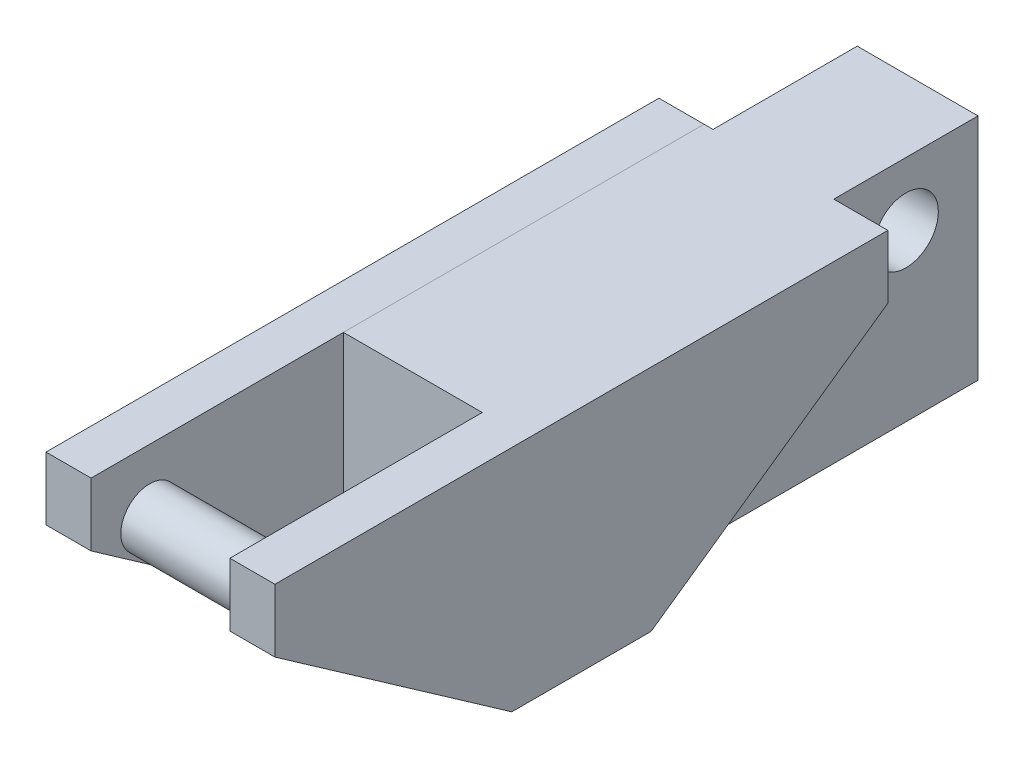
ISO-10303-21;
HEADER;
FILE_DESCRIPTION(('STEP AP214'),'2;1');
FILE_NAME('part.step','',(''),(''),'','','');
FILE_SCHEMA(('AUTOMOTIVE_DESIGN { 1 0 10303 214 1 1 1 1 }'));
ENDSEC;
DATA;
#1=APPLICATION_CONTEXT('core data for automotive mechanical design processes');
#2=APPLICATION_PROTOCOL_DEFINITION('international standard','automotive_design',2000,#1);
#3=PRODUCT_CONTEXT('',#1,'mechanical');
#4=PRODUCT('Part','Part','',(#3));
#5=PRODUCT_RELATED_PRODUCT_CATEGORY('part','',(#4));
#6=PRODUCT_DEFINITION_FORMATION('','',#4);
#7=PRODUCT_DEFINITION_CONTEXT('part definition',#1,'design');
#8=PRODUCT_DEFINITION('design','',#6,#7);
#9=PRODUCT_DEFINITION_SHAPE('','',#8);
#10=(LENGTH_UNIT() NAMED_UNIT(*) SI_UNIT(.MILLI.,.METRE.));
#11=(NAMED_UNIT(*) PLANE_ANGLE_UNIT() SI_UNIT($,.RADIAN.));
#12=(NAMED_UNIT(*) SI_UNIT($,.STERADIAN.) SOLID_ANGLE_UNIT());
#13=UNCERTAINTY_MEASURE_WITH_UNIT(LENGTH_MEASURE(1.E-05),#10,'distance_accuracy_value','');
#14=(GEOMETRIC_REPRESENTATION_CONTEXT(3) GLOBAL_UNCERTAINTY_ASSIGNED_CONTEXT((#13)) GLOBAL_UNIT_ASSIGNED_CONTEXT((#10,
#11,#12)) REPRESENTATION_CONTEXT('',''));
#15=CARTESIAN_POINT('',(0.,0.,0.));
#16=DIRECTION('',(0.,0.,1.));
#17=DIRECTION('',(1.,0.,0.));
#18=AXIS2_PLACEMENT_3D('',#15,#16,#17);
#19=CARTESIAN_POINT('',(-28.7781796503859,-0.00999999999999959,18.4558038197349));
#20=DIRECTION('',(1.,0.,0.));
#21=DIRECTION('',(0.,0.,-1.));
#22=AXIS2_PLACEMENT_3D('',#19,#20,#21);
#23=PLANE('',#22);
#24=DIRECTION('',(0.,-1.,0.));
#25=VECTOR('',#24,1.);
#26=CARTESIAN_POINT('',(-28.7781796503859,12.7,18.4558038197349));
#27=LINE('',#26,#25);
#28=CARTESIAN_POINT('',(-28.7781796503859,12.7,18.4558038197349));
#29=VERTEX_POINT('',#28);
#30=CARTESIAN_POINT('',(-28.7781796503859,9.2,18.4558038197349));
#31=VERTEX_POINT('',#30);
#32=EDGE_CURVE('E136',#29,#31,#27,.T.);
#33=ORIENTED_EDGE('',*,*,#32,.T.);
#34=DIRECTION('',(0.,-0.57357643635105,-0.819152044288989));
#35=VECTOR('',#34,1.);
#36=CARTESIAN_POINT('',(-28.7781796503859,1.68007341914141,7.71623566243481));
#37=LINE('',#36,#35);
#38=CARTESIAN_POINT('',(-28.7781796503859,0.,5.31684215770763));
#39=VERTEX_POINT('',#38);
#40=EDGE_CURVE('E90',#31,#39,#37,.T.);
#41=ORIENTED_EDGE('',*,*,#40,.T.);
#42=DIRECTION('',(0.,0.,-1.));
#43=VECTOR('',#42,1.);
#44=CARTESIAN_POINT('',(-28.7781796503859,0.,0.));
#45=LINE('',#44,#43);
#46=CARTESIAN_POINT('',(-28.7781796503859,0.,-2.40523451823775));
#47=VERTEX_POINT('',#46);
#48=EDGE_CURVE('E152',#39,#47,#45,.T.);
#49=ORIENTED_EDGE('',*,*,#48,.T.);
#50=DIRECTION('',(0.,-0.57357643635105,0.819152044288989));
#51=VECTOR('',#50,1.);
#52=CARTESIAN_POINT('',(-28.7781796503859,9.2,-15.5441961802651));
#53=LINE('',#52,#51);
#54=CARTESIAN_POINT('',(-28.7781796503859,9.2,-15.5441961802651));
#55=VERTEX_POINT('',#54);
#56=EDGE_CURVE('E127',#55,#47,#53,.T.);
#57=ORIENTED_EDGE('',*,*,#56,.F.);
#58=DIRECTION('',(0.,-1.,0.));
#59=VECTOR('',#58,1.);
#60=CARTESIAN_POINT('',(-28.7781796503859,12.7,-15.5441961802651));
#61=LINE('',#60,#59);
#62=CARTESIAN_POINT('',(-28.7781796503859,12.7,-15.5441961802651));
#63=VERTEX_POINT('',#62);
#64=EDGE_CURVE('E126',#63,#55,#61,.T.);
#65=ORIENTED_EDGE('',*,*,#64,.F.);
#66=DIRECTION('',(0.,0.,-1.));
#67=VECTOR('',#66,1.);
#68=CARTESIAN_POINT('',(-28.7781796503859,12.7,0.));
#69=LINE('',#68,#67);
#70=EDGE_CURVE('E114',#29,#63,#69,.T.);
#71=ORIENTED_EDGE('',*,*,#70,.F.);
#72=EDGE_LOOP('',(#33,#41,#49,#57,#65,#71));
#73=FACE_BOUND('',#72,.T.);
#74=ADVANCED_FACE('F57',(#73),#23,.T.);
#75=CARTESIAN_POINT('',(0.,0.,0.));
#76=DIRECTION('',(0.,1.,0.));
#77=DIRECTION('',(0.,0.,1.));
#78=AXIS2_PLACEMENT_3D('',#75,#76,#77);
#79=PLANE('',#78);
#80=DIRECTION('',(-1.,0.,0.));
#81=VECTOR('',#80,1.);
#82=CARTESIAN_POINT('',(-28.2781796503859,0.,-2.40523451823775));
#83=LINE('',#82,#81);
#84=CARTESIAN_POINT('',(-31.2781796503859,0.,-2.40523451823775));
#85=VERTEX_POINT('',#84);
#86=EDGE_CURVE('E61',#47,#85,#83,.T.);
#87=ORIENTED_EDGE('',*,*,#86,.F.);
#88=ORIENTED_EDGE('',*,*,#48,.F.);
#89=DIRECTION('',(-1.,0.,0.));
#90=VECTOR('',#89,1.);
#91=CARTESIAN_POINT('',(-28.2781796503859,0.,5.31684215770763));
#92=LINE('',#91,#90);
#93=CARTESIAN_POINT('',(-31.2781796503859,0.,5.31684215770763));
#94=VERTEX_POINT('',#93);
#95=EDGE_CURVE('E140',#39,#94,#92,.T.);
#96=ORIENTED_EDGE('',*,*,#95,.T.);
#97=DIRECTION('',(0.,0.,1.));
#98=VECTOR('',#97,1.);
#99=CARTESIAN_POINT('',(-31.2781796503859,0.,0.));
#100=LINE('',#99,#98);
#101=EDGE_CURVE('E154',#85,#94,#100,.T.);
#102=ORIENTED_EDGE('',*,*,#101,.F.);
#103=EDGE_LOOP('',(#87,#88,#96,#102));
#104=FACE_BOUND('',#103,.T.);
#105=ADVANCED_FACE('F167',(#104),#79,.F.);
#106=CARTESIAN_POINT('',(-31.2781796503859,12.7,0.));
#107=DIRECTION('',(1.,0.,0.));
#108=DIRECTION('',(0.,0.,-1.));
#109=AXIS2_PLACEMENT_3D('',#106,#107,#108);
#110=PLANE('',#109);
#111=ORIENTED_EDGE('',*,*,#101,.T.);
#112=DIRECTION('',(0.,-0.57357643635105,-0.819152044288989));
#113=VECTOR('',#112,1.);
#114=CARTESIAN_POINT('',(-31.2781796503859,9.2,18.4558038197349));
#115=LINE('',#114,#113);
#116=CARTESIAN_POINT('',(-31.2781796503859,9.2,18.4558038197349));
#117=VERTEX_POINT('',#116);
#118=EDGE_CURVE('E85',#117,#94,#115,.T.);
#119=ORIENTED_EDGE('',*,*,#118,.F.);
#120=DIRECTION('',(0.,-1.,0.));
#121=VECTOR('',#120,1.);
#122=CARTESIAN_POINT('',(-31.2781796503859,12.7,18.4558038197349));
#123=LINE('',#122,#121);
#124=CARTESIAN_POINT('',(-31.2781796503859,12.7,18.4558038197349));
#125=VERTEX_POINT('',#124);
#126=EDGE_CURVE('E145',#125,#117,#123,.T.);
#127=ORIENTED_EDGE('',*,*,#126,.F.);
#128=DIRECTION('',(0.,0.,1.));
#129=VECTOR('',#128,1.);
#130=CARTESIAN_POINT('',(-31.2781796503859,12.7,0.));
#131=LINE('',#130,#129);
#132=CARTESIAN_POINT('',(-31.2781796503859,12.7,-15.5441961802651));
#133=VERTEX_POINT('',#132);
#134=EDGE_CURVE('E155',#133,#125,#131,.T.);
#135=ORIENTED_EDGE('',*,*,#134,.F.);
#136=DIRECTION('',(0.,-1.,0.));
#137=VECTOR('',#136,1.);
#138=CARTESIAN_POINT('',(-31.2781796503859,12.7,-15.5441961802651));
#139=LINE('',#138,#137);
#140=CARTESIAN_POINT('',(-31.2781796503859,9.2,-15.5441961802651));
#141=VERTEX_POINT('',#140);
#142=EDGE_CURVE('E133',#133,#141,#139,.T.);
#143=ORIENTED_EDGE('',*,*,#142,.T.);
#144=DIRECTION('',(0.,-0.57357643635105,0.819152044288989));
#145=VECTOR('',#144,1.);
#146=CARTESIAN_POINT('',(-31.2781796503859,9.2,-15.5441961802651));
#147=LINE('',#146,#145);
#148=EDGE_CURVE('E12',#141,#85,#147,.T.);
#149=ORIENTED_EDGE('',*,*,#148,.T.);
#150=EDGE_LOOP('',(#111,#119,#127,#135,#143,#149));
#151=FACE_BOUND('',#150,.T.);
#152=ADVANCED_FACE('F163',(#151),#110,.F.);
#153=CARTESIAN_POINT('',(0.,12.7,18.4558038197349));
#154=DIRECTION('',(0.,0.,-1.));
#155=DIRECTION('',(-1.,0.,0.));
#156=AXIS2_PLACEMENT_3D('',#153,#154,#155);
#157=PLANE('',#156);
#158=ORIENTED_EDGE('',*,*,#126,.T.);
#159=DIRECTION('',(-1.,0.,0.));
#160=VECTOR('',#159,1.);
#161=CARTESIAN_POINT('',(-28.2781796503859,9.2,18.4558038197349));
#162=LINE('',#161,#160);
#163=EDGE_CURVE('E142',#31,#117,#162,.T.);
#164=ORIENTED_EDGE('',*,*,#163,.F.);
#165=ORIENTED_EDGE('',*,*,#32,.F.);
#166=DIRECTION('',(1.,0.,0.));
#167=VECTOR('',#166,1.);
#168=CARTESIAN_POINT('',(0.,12.7,18.4558038197349));
#169=LINE('',#168,#167);
#170=EDGE_CURVE('E120',#125,#29,#169,.T.);
#171=ORIENTED_EDGE('',*,*,#170,.F.);
#172=EDGE_LOOP('',(#158,#164,#165,#171));
#173=FACE_BOUND('',#172,.T.);
#174=ADVANCED_FACE('F165',(#173),#157,.F.);
#175=CARTESIAN_POINT('',(-28.2781796503859,9.2,18.4558038197349));
#176=DIRECTION('',(0.,0.819152044288989,-0.57357643635105));
#177=DIRECTION('',(0.,0.57357643635105,0.819152044288989));
#178=AXIS2_PLACEMENT_3D('',#175,#176,#177);
#179=PLANE('',#178);
#180=ORIENTED_EDGE('',*,*,#163,.T.);
#181=ORIENTED_EDGE('',*,*,#118,.T.);
#182=ORIENTED_EDGE('',*,*,#95,.F.);
#183=ORIENTED_EDGE('',*,*,#40,.F.);
#184=EDGE_LOOP('',(#180,#181,#182,#183));
#185=FACE_BOUND('',#184,.T.);
#186=ADVANCED_FACE('F159',(#185),#179,.F.);
#187=CARTESIAN_POINT('',(0.,12.7,-15.5441961802651));
#188=DIRECTION('',(0.,0.,-1.));
#189=DIRECTION('',(-1.,0.,0.));
#190=AXIS2_PLACEMENT_3D('',#187,#188,#189);
#191=PLANE('',#190);
#192=DIRECTION('',(1.,0.,0.));
#193=VECTOR('',#192,1.);
#194=CARTESIAN_POINT('',(0.,12.7,-15.5441961802651));
#195=LINE('',#194,#193);
#196=EDGE_CURVE('E119',#133,#63,#195,.T.);
#197=ORIENTED_EDGE('',*,*,#196,.T.);
#198=ORIENTED_EDGE('',*,*,#64,.T.);
#199=DIRECTION('',(-1.,0.,0.));
#200=VECTOR('',#199,1.);
#201=CARTESIAN_POINT('',(-28.2781796503859,9.2,-15.5441961802651));
#202=LINE('',#201,#200);
#203=EDGE_CURVE('E139',#55,#141,#202,.T.);
#204=ORIENTED_EDGE('',*,*,#203,.T.);
#205=ORIENTED_EDGE('',*,*,#142,.F.);
#206=EDGE_LOOP('',(#197,#198,#204,#205));
#207=FACE_BOUND('',#206,.T.);
#208=ADVANCED_FACE('F131',(#207),#191,.T.);
#209=CARTESIAN_POINT('',(-28.2781796503859,9.2,-15.5441961802651));
#210=DIRECTION('',(0.,-0.819152044288989,-0.57357643635105));
#211=DIRECTION('',(0.,0.57357643635105,-0.819152044288989));
#212=AXIS2_PLACEMENT_3D('',#209,#210,#211);
#213=PLANE('',#212);
#214=ORIENTED_EDGE('',*,*,#203,.F.);
#215=ORIENTED_EDGE('',*,*,#56,.T.);
#216=ORIENTED_EDGE('',*,*,#86,.T.);
#217=ORIENTED_EDGE('',*,*,#148,.F.);
#218=EDGE_LOOP('',(#214,#215,#216,#217));
#219=FACE_BOUND('',#218,.T.);
#220=ADVANCED_FACE('F59',(#219),#213,.T.);
#221=CARTESIAN_POINT('',(0.,12.7,0.));
#222=DIRECTION('',(0.,1.,0.));
#223=DIRECTION('',(0.,0.,1.));
#224=AXIS2_PLACEMENT_3D('',#221,#222,#223);
#225=PLANE('',#224);
#226=ORIENTED_EDGE('',*,*,#70,.T.);
#227=ORIENTED_EDGE('',*,*,#196,.F.);
#228=ORIENTED_EDGE('',*,*,#134,.T.);
#229=ORIENTED_EDGE('',*,*,#170,.T.);
#230=EDGE_LOOP('',(#226,#227,#228,#229));
#231=FACE_BOUND('',#230,.T.);
#232=ADVANCED_FACE('F116',(#231),#225,.T.);
#233=CLOSED_SHELL('',(#74,#105,#152,#174,#186,#208,#220,#232));
#234=MANIFOLD_SOLID_BREP('B2',#233);
#235=CARTESIAN_POINT('',(-28.7781796503859,-0.00999999999999959,18.4558038197349));
#236=DIRECTION('',(1.,0.,0.));
#237=DIRECTION('',(0.,0.,-1.));
#238=AXIS2_PLACEMENT_3D('',#235,#236,#237);
#239=PLANE('',#238);
#240=CARTESIAN_POINT('',(-28.7781796503859,9.2,15.2058038197349));
#241=DIRECTION('',(-1.,0.,0.));
#242=DIRECTION('',(0.,0.,1.));
#243=AXIS2_PLACEMENT_3D('',#240,#241,#242);
#244=CIRCLE('',#243,1.6);
#245=CARTESIAN_POINT('',(-28.7781796503859,9.2,13.6058038197349));
#246=VERTEX_POINT('',#245);
#247=EDGE_CURVE('E429',#246,#246,#244,.F.);
#248=ORIENTED_EDGE('',*,*,#247,.F.);
#249=EDGE_LOOP('',(#248));
#250=FACE_BOUND('',#249,.T.);
#251=ADVANCED_FACE('F292',(#250),#239,.F.);
#252=DIRECTION('',(0.,0.,-1.));
#253=VECTOR('',#252,1.);
#254=CARTESIAN_POINT('',(-28.7781796503859,12.7,0.));
#255=LINE('',#254,#253);
#256=CARTESIAN_POINT('',(-28.7781796503859,12.7,4.45580381973494));
#257=VERTEX_POINT('',#256);
#258=CARTESIAN_POINT('',(-28.7781796503859,12.7,-15.5441961802651));
#259=VERTEX_POINT('',#258);
#260=EDGE_CURVE('E299',#257,#259,#255,.T.);
#261=ORIENTED_EDGE('',*,*,#260,.T.);
#262=DIRECTION('',(0.,-1.,0.));
#263=VECTOR('',#262,1.);
#264=CARTESIAN_POINT('',(-28.7781796503859,12.7,-15.5441961802651));
#265=LINE('',#264,#263);
#266=CARTESIAN_POINT('',(-28.7781796503859,9.2,-15.5441961802651));
#267=VERTEX_POINT('',#266);
#268=EDGE_CURVE('E496',#259,#267,#265,.T.);
#269=ORIENTED_EDGE('',*,*,#268,.T.);
#270=DIRECTION('',(0.,-0.57357643635105,0.819152044288989));
#271=VECTOR('',#270,1.);
#272=CARTESIAN_POINT('',(-28.7781796503859,9.2,-15.5441961802651));
#273=LINE('',#272,#271);
#274=CARTESIAN_POINT('',(-28.7781796503859,0.,-2.40523451823775));
#275=VERTEX_POINT('',#274);
#276=EDGE_CURVE('E55',#267,#275,#273,.T.);
#277=ORIENTED_EDGE('',*,*,#276,.T.);
#278=DIRECTION('',(0.,0.,-1.));
#279=VECTOR('',#278,1.);
#280=CARTESIAN_POINT('',(-28.7781796503859,0.,0.));
#281=LINE('',#280,#279);
#282=CARTESIAN_POINT('',(-28.7781796503859,0.,4.45580381973494));
#283=VERTEX_POINT('',#282);
#284=EDGE_CURVE('E312',#283,#275,#281,.T.);
#285=ORIENTED_EDGE('',*,*,#284,.F.);
#286=DIRECTION('',(0.,-1.,0.));
#287=VECTOR('',#286,1.);
#288=CARTESIAN_POINT('',(-28.7781796503859,12.7,4.45580381973494));
#289=LINE('',#288,#287);
#290=EDGE_CURVE('E488',#257,#283,#289,.T.);
#291=ORIENTED_EDGE('',*,*,#290,.F.);
#292=EDGE_LOOP('',(#261,#269,#277,#285,#291));
#293=FACE_BOUND('',#292,.T.);
#294=ADVANCED_FACE('F498',(#293),#239,.F.);
#295=CARTESIAN_POINT('',(0.,0.,0.));
#296=DIRECTION('',(0.,1.,0.));
#297=DIRECTION('',(0.,0.,1.));
#298=AXIS2_PLACEMENT_3D('',#295,#296,#297);
#299=PLANE('',#298);
#300=DIRECTION('',(1.,0.,0.));
#301=VECTOR('',#300,1.);
#302=CARTESIAN_POINT('',(0.,0.,4.45580381973494));
#303=LINE('',#302,#301);
#304=CARTESIAN_POINT('',(-21.0781796503859,0.,4.45580381973494));
#305=VERTEX_POINT('',#304);
#306=EDGE_CURVE('E436',#283,#305,#303,.T.);
#307=ORIENTED_EDGE('',*,*,#306,.F.);
#308=ORIENTED_EDGE('',*,*,#284,.T.);
#309=DIRECTION('',(-1.,0.,0.));
#310=VECTOR('',#309,1.);
#311=CARTESIAN_POINT('',(-28.2781796503859,0.,-2.40523451823775));
#312=LINE('',#311,#310);
#313=CARTESIAN_POINT('',(-28.2781796503859,0.,-2.40523451823775));
#314=VERTEX_POINT('',#313);
#315=EDGE_CURVE('E400',#314,#275,#312,.T.);
#316=ORIENTED_EDGE('',*,*,#315,.F.);
#317=DIRECTION('',(0.,0.,1.));
#318=VECTOR('',#317,1.);
#319=CARTESIAN_POINT('',(-28.2781796503859,0.,0.));
#320=LINE('',#319,#318);
#321=CARTESIAN_POINT('',(-28.2781796503859,0.,-23.5441961802651));
#322=VERTEX_POINT('',#321);
#323=EDGE_CURVE('E386',#322,#314,#320,.T.);
#324=ORIENTED_EDGE('',*,*,#323,.F.);
#325=DIRECTION('',(1.,0.,0.));
#326=VECTOR('',#325,1.);
#327=CARTESIAN_POINT('',(0.,0.,-23.5441961802651));
#328=LINE('',#327,#326);
#329=CARTESIAN_POINT('',(-21.5781796503859,0.,-23.5441961802651));
#330=VERTEX_POINT('',#329);
#331=EDGE_CURVE('E397',#322,#330,#328,.T.);
#332=ORIENTED_EDGE('',*,*,#331,.T.);
#333=DIRECTION('',(0.,0.,1.));
#334=VECTOR('',#333,1.);
#335=CARTESIAN_POINT('',(-21.5781796503859,0.,0.));
#336=LINE('',#335,#334);
#337=CARTESIAN_POINT('',(-21.5781796503859,0.,-2.40523451823775));
#338=VERTEX_POINT('',#337);
#339=EDGE_CURVE('E465',#330,#338,#336,.T.);
#340=ORIENTED_EDGE('',*,*,#339,.T.);
#341=DIRECTION('',(1.,0.,0.));
#342=VECTOR('',#341,1.);
#343=CARTESIAN_POINT('',(-21.5781796503859,0.,-2.40523451823775));
#344=LINE('',#343,#342);
#345=CARTESIAN_POINT('',(-18.5781796503859,0.,-2.40523451823775));
#346=VERTEX_POINT('',#345);
#347=EDGE_CURVE('E406',#338,#346,#344,.T.);
#348=ORIENTED_EDGE('',*,*,#347,.T.);
#349=DIRECTION('',(0.,0.,1.));
#350=VECTOR('',#349,1.);
#351=CARTESIAN_POINT('',(-18.5781796503859,0.,0.));
#352=LINE('',#351,#350);
#353=CARTESIAN_POINT('',(-18.5781796503859,0.,5.31684215770762));
#354=VERTEX_POINT('',#353);
#355=EDGE_CURVE('E462',#346,#354,#352,.T.);
#356=ORIENTED_EDGE('',*,*,#355,.T.);
#357=DIRECTION('',(1.,0.,0.));
#358=VECTOR('',#357,1.);
#359=CARTESIAN_POINT('',(0.,0.,5.31684215770762));
#360=LINE('',#359,#358);
#361=CARTESIAN_POINT('',(-21.0781796503859,0.,5.31684215770762));
#362=VERTEX_POINT('',#361);
#363=EDGE_CURVE('E490',#362,#354,#360,.T.);
#364=ORIENTED_EDGE('',*,*,#363,.F.);
#365=DIRECTION('',(0.,0.,1.));
#366=VECTOR('',#365,1.);
#367=CARTESIAN_POINT('',(-21.0781796503859,0.,0.));
#368=LINE('',#367,#366);
#369=EDGE_CURVE('E459',#305,#362,#368,.T.);
#370=ORIENTED_EDGE('',*,*,#369,.F.);
#371=EDGE_LOOP('',(#307,#308,#316,#324,#332,#340,#348,#356,#364,#370));
#372=FACE_BOUND('',#371,.T.);
#373=ADVANCED_FACE('F404',(#372),#299,.F.);
#374=CARTESIAN_POINT('',(0.,12.7,-15.5441961802651));
#375=DIRECTION('',(0.,0.,-1.));
#376=DIRECTION('',(-1.,0.,0.));
#377=AXIS2_PLACEMENT_3D('',#374,#375,#376);
#378=PLANE('',#377);
#379=ORIENTED_EDGE('',*,*,#268,.F.);
#380=DIRECTION('',(1.,0.,0.));
#381=VECTOR('',#380,1.);
#382=CARTESIAN_POINT('',(0.,12.7,-15.5441961802651));
#383=LINE('',#382,#381);
#384=CARTESIAN_POINT('',(-28.2781796503859,12.7,-15.5441961802651));
#385=VERTEX_POINT('',#384);
#386=EDGE_CURVE('E449',#259,#385,#383,.T.);
#387=ORIENTED_EDGE('',*,*,#386,.T.);
#388=DIRECTION('',(0.,-1.,0.));
#389=VECTOR('',#388,1.);
#390=CARTESIAN_POINT('',(-28.2781796503859,12.7,-15.5441961802651));
#391=LINE('',#390,#389);
#392=CARTESIAN_POINT('',(-28.2781796503859,9.2,-15.5441961802651));
#393=VERTEX_POINT('',#392);
#394=EDGE_CURVE('E468',#385,#393,#391,.T.);
#395=ORIENTED_EDGE('',*,*,#394,.T.);
#396=DIRECTION('',(-1.,0.,0.));
#397=VECTOR('',#396,1.);
#398=CARTESIAN_POINT('',(-28.2781796503859,9.2,-15.5441961802651));
#399=LINE('',#398,#397);
#400=EDGE_CURVE('E402',#393,#267,#399,.T.);
#401=ORIENTED_EDGE('',*,*,#400,.T.);
#402=EDGE_LOOP('',(#379,#387,#395,#401));
#403=FACE_BOUND('',#402,.T.);
#404=ADVANCED_FACE('F502',(#403),#378,.T.);
#405=CARTESIAN_POINT('',(-21.0781796503859,12.7,0.));
#406=DIRECTION('',(1.,0.,0.));
#407=DIRECTION('',(0.,0.,-1.));
#408=AXIS2_PLACEMENT_3D('',#405,#406,#407);
#409=PLANE('',#408);
#410=CARTESIAN_POINT('',(-21.0781796503859,9.2,15.2058038197349));
#411=DIRECTION('',(1.,0.,0.));
#412=DIRECTION('',(0.,0.,-1.));
#413=AXIS2_PLACEMENT_3D('',#410,#411,#412);
#414=CIRCLE('',#413,1.6);
#415=CARTESIAN_POINT('',(-21.0781796503859,9.2,13.6058038197349));
#416=VERTEX_POINT('',#415);
#417=EDGE_CURVE('E426',#416,#416,#414,.T.);
#418=ORIENTED_EDGE('',*,*,#417,.T.);
#419=EDGE_LOOP('',(#418));
#420=FACE_BOUND('',#419,.T.);
#421=DIRECTION('',(0.,-0.57357643635105,-0.819152044288989));
#422=VECTOR('',#421,1.);
#423=CARTESIAN_POINT('',(-21.0781796503859,1.68007341914141,7.71623566243481));
#424=LINE('',#423,#422);
#425=CARTESIAN_POINT('',(-21.0781796503859,9.2,18.4558038197349));
#426=VERTEX_POINT('',#425);
#427=EDGE_CURVE('E416',#426,#362,#424,.T.);
#428=ORIENTED_EDGE('',*,*,#427,.F.);
#429=DIRECTION('',(0.,-1.,0.));
#430=VECTOR('',#429,1.);
#431=CARTESIAN_POINT('',(-21.0781796503859,12.7,18.4558038197349));
#432=LINE('',#431,#430);
#433=CARTESIAN_POINT('',(-21.0781796503859,12.7,18.4558038197349));
#434=VERTEX_POINT('',#433);
#435=EDGE_CURVE('E482',#434,#426,#432,.T.);
#436=ORIENTED_EDGE('',*,*,#435,.F.);
#437=DIRECTION('',(0.,0.,1.));
#438=VECTOR('',#437,1.);
#439=CARTESIAN_POINT('',(-21.0781796503859,12.7,0.));
#440=LINE('',#439,#438);
#441=CARTESIAN_POINT('',(-21.0781796503859,12.7,4.45580381973494));
#442=VERTEX_POINT('',#441);
#443=EDGE_CURVE('E438',#442,#434,#440,.T.);
#444=ORIENTED_EDGE('',*,*,#443,.F.);
#445=DIRECTION('',(0.,-1.,0.));
#446=VECTOR('',#445,1.);
#447=CARTESIAN_POINT('',(-21.0781796503859,12.7,4.45580381973494));
#448=LINE('',#447,#446);
#449=EDGE_CURVE('E485',#442,#305,#448,.T.);
#450=ORIENTED_EDGE('',*,*,#449,.T.);
#451=ORIENTED_EDGE('',*,*,#369,.T.);
#452=EDGE_LOOP('',(#428,#436,#444,#450,#451));
#453=FACE_BOUND('',#452,.T.);
#454=ADVANCED_FACE('F534',(#420,#453),#409,.F.);
#455=CARTESIAN_POINT('',(0.,12.7,18.4558038197349));
#456=DIRECTION('',(0.,0.,-1.));
#457=DIRECTION('',(-1.,0.,0.));
#458=AXIS2_PLACEMENT_3D('',#455,#456,#457);
#459=PLANE('',#458);
#460=DIRECTION('',(1.,0.,0.));
#461=VECTOR('',#460,1.);
#462=CARTESIAN_POINT('',(-21.5781796503859,9.2,18.4558038197349));
#463=LINE('',#462,#461);
#464=CARTESIAN_POINT('',(-18.5781796503859,9.2,18.4558038197349));
#465=VERTEX_POINT('',#464);
#466=EDGE_CURVE('E412',#426,#465,#463,.T.);
#467=ORIENTED_EDGE('',*,*,#466,.T.);
#468=DIRECTION('',(0.,-1.,0.));
#469=VECTOR('',#468,1.);
#470=CARTESIAN_POINT('',(-18.5781796503859,12.7,18.4558038197349));
#471=LINE('',#470,#469);
#472=CARTESIAN_POINT('',(-18.5781796503859,12.7,18.4558038197349));
#473=VERTEX_POINT('',#472);
#474=EDGE_CURVE('E479',#473,#465,#471,.T.);
#475=ORIENTED_EDGE('',*,*,#474,.F.);
#476=DIRECTION('',(1.,0.,0.));
#477=VECTOR('',#476,1.);
#478=CARTESIAN_POINT('',(0.,12.7,18.4558038197349));
#479=LINE('',#478,#477);
#480=EDGE_CURVE('E440',#434,#473,#479,.T.);
#481=ORIENTED_EDGE('',*,*,#480,.F.);
#482=ORIENTED_EDGE('',*,*,#435,.T.);
#483=EDGE_LOOP('',(#467,#475,#481,#482));
#484=FACE_BOUND('',#483,.T.);
#485=ADVANCED_FACE('F527',(#484),#459,.F.);
#486=CARTESIAN_POINT('',(-18.5781796503859,12.7,0.));
#487=DIRECTION('',(1.,0.,0.));
#488=DIRECTION('',(0.,0.,-1.));
#489=AXIS2_PLACEMENT_3D('',#486,#487,#488);
#490=PLANE('',#489);
#491=ORIENTED_EDGE('',*,*,#474,.T.);
#492=DIRECTION('',(0.,-0.57357643635105,-0.819152044288989));
#493=VECTOR('',#492,1.);
#494=CARTESIAN_POINT('',(-18.5781796503859,9.2,18.4558038197349));
#495=LINE('',#494,#493);
#496=EDGE_CURVE('E409',#465,#354,#495,.T.);
#497=ORIENTED_EDGE('',*,*,#496,.T.);
#498=ORIENTED_EDGE('',*,*,#355,.F.);
#499=DIRECTION('',(0.,-0.57357643635105,0.819152044288989));
#500=VECTOR('',#499,1.);
#501=CARTESIAN_POINT('',(-18.5781796503859,9.2,-15.5441961802651));
#502=LINE('',#501,#500);
#503=CARTESIAN_POINT('',(-18.5781796503859,9.2,-15.5441961802651));
#504=VERTEX_POINT('',#503);
#505=EDGE_CURVE('E413',#504,#346,#502,.T.);
#506=ORIENTED_EDGE('',*,*,#505,.F.);
#507=DIRECTION('',(0.,-1.,0.));
#508=VECTOR('',#507,1.);
#509=CARTESIAN_POINT('',(-18.5781796503859,12.7,-15.5441961802651));
#510=LINE('',#509,#508);
#511=CARTESIAN_POINT('',(-18.5781796503859,12.7,-15.5441961802651));
#512=VERTEX_POINT('',#511);
#513=EDGE_CURVE('E476',#512,#504,#510,.T.);
#514=ORIENTED_EDGE('',*,*,#513,.F.);
#515=DIRECTION('',(0.,0.,1.));
#516=VECTOR('',#515,1.);
#517=CARTESIAN_POINT('',(-18.5781796503859,12.7,0.));
#518=LINE('',#517,#516);
#519=EDGE_CURVE('E442',#512,#473,#518,.T.);
#520=ORIENTED_EDGE('',*,*,#519,.T.);
#521=EDGE_LOOP('',(#491,#497,#498,#506,#514,#520));
#522=FACE_BOUND('',#521,.T.);
#523=ADVANCED_FACE('F520',(#522),#490,.T.);
#524=CARTESIAN_POINT('',(0.,12.7,4.45580381973494));
#525=DIRECTION('',(0.,0.,-1.));
#526=DIRECTION('',(-1.,0.,0.));
#527=AXIS2_PLACEMENT_3D('',#524,#525,#526);
#528=PLANE('',#527);
#529=ORIENTED_EDGE('',*,*,#306,.T.);
#530=ORIENTED_EDGE('',*,*,#449,.F.);
#531=DIRECTION('',(1.,0.,0.));
#532=VECTOR('',#531,1.);
#533=CARTESIAN_POINT('',(0.,12.7,4.45580381973494));
#534=LINE('',#533,#532);
#535=EDGE_CURVE('E396',#257,#442,#534,.T.);
#536=ORIENTED_EDGE('',*,*,#535,.F.);
#537=ORIENTED_EDGE('',*,*,#290,.T.);
#538=EDGE_LOOP('',(#529,#530,#536,#537));
#539=FACE_BOUND('',#538,.T.);
#540=ADVANCED_FACE('F539',(#539),#528,.F.);
#541=DIRECTION('',(1.,0.,0.));
#542=VECTOR('',#541,1.);
#543=CARTESIAN_POINT('',(-21.5781796503859,9.2,-15.5441961802651));
#544=LINE('',#543,#542);
#545=CARTESIAN_POINT('',(-21.5781796503859,9.2,-15.5441961802651));
#546=VERTEX_POINT('',#545);
#547=EDGE_CURVE('E417',#546,#504,#544,.T.);
#548=ORIENTED_EDGE('',*,*,#547,.F.);
#549=DIRECTION('',(0.,-1.,0.));
#550=VECTOR('',#549,1.);
#551=CARTESIAN_POINT('',(-21.5781796503859,12.7,-15.5441961802651));
#552=LINE('',#551,#550);
#553=CARTESIAN_POINT('',(-21.5781796503859,12.7,-15.5441961802651));
#554=VERTEX_POINT('',#553);
#555=EDGE_CURVE('E473',#554,#546,#552,.T.);
#556=ORIENTED_EDGE('',*,*,#555,.F.);
#557=EDGE_CURVE('E445',#554,#512,#383,.T.);
#558=ORIENTED_EDGE('',*,*,#557,.T.);
#559=ORIENTED_EDGE('',*,*,#513,.T.);
#560=EDGE_LOOP('',(#548,#556,#558,#559));
#561=FACE_BOUND('',#560,.T.);
#562=ADVANCED_FACE('F523',(#561),#378,.T.);
#563=CARTESIAN_POINT('',(-21.5781796503859,12.7,0.));
#564=DIRECTION('',(1.,0.,0.));
#565=DIRECTION('',(0.,0.,-1.));
#566=AXIS2_PLACEMENT_3D('',#563,#564,#565);
#567=PLANE('',#566);
#568=CARTESIAN_POINT('',(-21.5781796503859,9.2,-19.5441961802651));
#569=DIRECTION('',(1.,0.,0.));
#570=DIRECTION('',(0.,0.,-1.));
#571=AXIS2_PLACEMENT_3D('',#568,#569,#570);
#572=CIRCLE('',#571,1.8);
#573=CARTESIAN_POINT('',(-21.5781796503859,9.2,-21.3441961802651));
#574=VERTEX_POINT('',#573);
#575=EDGE_CURVE('E433',#574,#574,#572,.T.);
#576=ORIENTED_EDGE('',*,*,#575,.F.);
#577=EDGE_LOOP('',(#576));
#578=FACE_BOUND('',#577,.T.);
#579=ORIENTED_EDGE('',*,*,#339,.F.);
#580=DIRECTION('',(0.,-1.,0.));
#581=VECTOR('',#580,1.);
#582=CARTESIAN_POINT('',(-21.5781796503859,12.7,-23.5441961802651));
#583=LINE('',#582,#581);
#584=CARTESIAN_POINT('',(-21.5781796503859,12.7,-23.5441961802651));
#585=VERTEX_POINT('',#584);
#586=EDGE_CURVE('E471',#585,#330,#583,.T.);
#587=ORIENTED_EDGE('',*,*,#586,.F.);
#588=DIRECTION('',(0.,0.,1.));
#589=VECTOR('',#588,1.);
#590=CARTESIAN_POINT('',(-21.5781796503859,12.7,0.));
#591=LINE('',#590,#589);
#592=EDGE_CURVE('E448',#585,#554,#591,.T.);
#593=ORIENTED_EDGE('',*,*,#592,.T.);
#594=ORIENTED_EDGE('',*,*,#555,.T.);
#595=DIRECTION('',(0.,-0.57357643635105,0.819152044288989));
#596=VECTOR('',#595,1.);
#597=CARTESIAN_POINT('',(-21.5781796503859,9.2,-15.5441961802651));
#598=LINE('',#597,#596);
#599=EDGE_CURVE('E419',#546,#338,#598,.T.);
#600=ORIENTED_EDGE('',*,*,#599,.T.);
#601=EDGE_LOOP('',(#579,#587,#593,#594,#600));
#602=FACE_BOUND('',#601,.T.);
#603=ADVANCED_FACE('F514',(#578,#602),#567,.T.);
#604=CARTESIAN_POINT('',(0.,12.7,-23.5441961802651));
#605=DIRECTION('',(0.,0.,-1.));
#606=DIRECTION('',(-1.,0.,0.));
#607=AXIS2_PLACEMENT_3D('',#604,#605,#606);
#608=PLANE('',#607);
#609=ORIENTED_EDGE('',*,*,#331,.F.);
#610=DIRECTION('',(0.,-1.,0.));
#611=VECTOR('',#610,1.);
#612=CARTESIAN_POINT('',(-28.2781796503859,12.7,-23.5441961802651));
#613=LINE('',#612,#611);
#614=CARTESIAN_POINT('',(-28.2781796503859,12.7,-23.5441961802651));
#615=VERTEX_POINT('',#614);
#616=EDGE_CURVE('E393',#615,#322,#613,.T.);
#617=ORIENTED_EDGE('',*,*,#616,.F.);
#618=DIRECTION('',(1.,0.,0.));
#619=VECTOR('',#618,1.);
#620=CARTESIAN_POINT('',(0.,12.7,-23.5441961802651));
#621=LINE('',#620,#619);
#622=EDGE_CURVE('E452',#615,#585,#621,.T.);
#623=ORIENTED_EDGE('',*,*,#622,.T.);
#624=ORIENTED_EDGE('',*,*,#586,.T.);
#625=EDGE_LOOP('',(#609,#617,#623,#624));
#626=FACE_BOUND('',#625,.T.);
#627=ADVANCED_FACE('F509',(#626),#608,.T.);
#628=CARTESIAN_POINT('',(-28.2781796503859,12.7,0.));
#629=DIRECTION('',(1.,0.,0.));
#630=DIRECTION('',(0.,0.,-1.));
#631=AXIS2_PLACEMENT_3D('',#628,#629,#630);
#632=PLANE('',#631);
#633=CARTESIAN_POINT('',(-28.2781796503859,9.2,-19.5441961802651));
#634=DIRECTION('',(1.,0.,0.));
#635=DIRECTION('',(0.,0.,-1.));
#636=AXIS2_PLACEMENT_3D('',#633,#634,#635);
#637=CIRCLE('',#636,1.8);
#638=CARTESIAN_POINT('',(-28.2781796503859,9.2,-21.3441961802651));
#639=VERTEX_POINT('',#638);
#640=EDGE_CURVE('E432',#639,#639,#637,.T.);
#641=ORIENTED_EDGE('',*,*,#640,.T.);
#642=EDGE_LOOP('',(#641));
#643=FACE_BOUND('',#642,.T.);
#644=ORIENTED_EDGE('',*,*,#323,.T.);
#645=DIRECTION('',(0.,-0.57357643635105,0.819152044288989));
#646=VECTOR('',#645,1.);
#647=CARTESIAN_POINT('',(-28.2781796503859,9.2,-15.5441961802651));
#648=LINE('',#647,#646);
#649=EDGE_CURVE('E390',#393,#314,#648,.T.);
#650=ORIENTED_EDGE('',*,*,#649,.F.);
#651=ORIENTED_EDGE('',*,*,#394,.F.);
#652=DIRECTION('',(0.,0.,1.));
#653=VECTOR('',#652,1.);
#654=CARTESIAN_POINT('',(-28.2781796503859,12.7,0.));
#655=LINE('',#654,#653);
#656=EDGE_CURVE('E455',#615,#385,#655,.T.);
#657=ORIENTED_EDGE('',*,*,#656,.F.);
#658=ORIENTED_EDGE('',*,*,#616,.T.);
#659=EDGE_LOOP('',(#644,#650,#651,#657,#658));
#660=FACE_BOUND('',#659,.T.);
#661=ADVANCED_FACE('F388',(#643,#660),#632,.F.);
#662=CARTESIAN_POINT('',(0.,12.7,0.));
#663=DIRECTION('',(0.,1.,0.));
#664=DIRECTION('',(0.,0.,1.));
#665=AXIS2_PLACEMENT_3D('',#662,#663,#664);
#666=PLANE('',#665);
#667=ORIENTED_EDGE('',*,*,#260,.F.);
#668=ORIENTED_EDGE('',*,*,#535,.T.);
#669=ORIENTED_EDGE('',*,*,#443,.T.);
#670=ORIENTED_EDGE('',*,*,#480,.T.);
#671=ORIENTED_EDGE('',*,*,#519,.F.);
#672=ORIENTED_EDGE('',*,*,#557,.F.);
#673=ORIENTED_EDGE('',*,*,#592,.F.);
#674=ORIENTED_EDGE('',*,*,#622,.F.);
#675=ORIENTED_EDGE('',*,*,#656,.T.);
#676=ORIENTED_EDGE('',*,*,#386,.F.);
#677=EDGE_LOOP('',(#667,#668,#669,#670,#671,#672,#673,#674,#675,#676));
#678=FACE_BOUND('',#677,.T.);
#679=ADVANCED_FACE('F506',(#678),#666,.T.);
#680=CARTESIAN_POINT('',(-31.2781796503859,9.2,-19.5441961802651));
#681=DIRECTION('',(1.,0.,0.));
#682=DIRECTION('',(0.,0.,-1.));
#683=AXIS2_PLACEMENT_3D('',#680,#681,#682);
#684=CYLINDRICAL_SURFACE('',#683,1.8);
#685=ORIENTED_EDGE('',*,*,#575,.T.);
#686=EDGE_LOOP('',(#685));
#687=FACE_BOUND('',#686,.T.);
#688=ORIENTED_EDGE('',*,*,#640,.F.);
#689=EDGE_LOOP('',(#688));
#690=FACE_BOUND('',#689,.T.);
#691=ADVANCED_FACE('F558',(#687,#690),#684,.F.);
#692=CARTESIAN_POINT('',(-31.2801796503859,9.2,15.2058038197349));
#693=DIRECTION('',(1.,0.,0.));
#694=DIRECTION('',(0.,0.,-1.));
#695=AXIS2_PLACEMENT_3D('',#692,#693,#694);
#696=CYLINDRICAL_SURFACE('',#695,1.6);
#697=CARTESIAN_POINT('',(-21.0781796503859,9.2,13.6058038197349));
#698=CARTESIAN_POINT('',(-21.1583879837193,9.2,13.6058038197349));
#699=CARTESIAN_POINT('',(-21.2385963170526,9.2,13.6058038197349));
#700=CARTESIAN_POINT('',(-21.3990129837193,9.2,13.6058038197349));
#701=CARTESIAN_POINT('',(-21.4792213170526,9.2,13.6058038197349));
#702=CARTESIAN_POINT('',(-21.6396379837193,9.2,13.6058038197349));
#703=CARTESIAN_POINT('',(-21.7198463170526,9.2,13.6058038197349));
#704=CARTESIAN_POINT('',(-21.8802629837193,9.2,13.6058038197349));
#705=CARTESIAN_POINT('',(-21.9604713170526,9.2,13.6058038197349));
#706=CARTESIAN_POINT('',(-22.1208879837193,9.2,13.6058038197349));
#707=CARTESIAN_POINT('',(-22.2010963170526,9.2,13.6058038197349));
#708=CARTESIAN_POINT('',(-22.3615129837193,9.2,13.6058038197349));
#709=CARTESIAN_POINT('',(-22.4417213170526,9.2,13.6058038197349));
#710=CARTESIAN_POINT('',(-22.6021379837193,9.2,13.6058038197349));
#711=CARTESIAN_POINT('',(-22.6823463170526,9.2,13.6058038197349));
#712=CARTESIAN_POINT('',(-22.8427629837193,9.2,13.6058038197349));
#713=CARTESIAN_POINT('',(-22.9229713170526,9.2,13.6058038197349));
#714=CARTESIAN_POINT('',(-23.0833879837193,9.2,13.6058038197349));
#715=CARTESIAN_POINT('',(-23.1635963170526,9.2,13.6058038197349));
#716=CARTESIAN_POINT('',(-23.3240129837193,9.2,13.6058038197349));
#717=CARTESIAN_POINT('',(-23.4042213170526,9.2,13.6058038197349));
#718=CARTESIAN_POINT('',(-23.5646379837193,9.2,13.6058038197349));
#719=CARTESIAN_POINT('',(-23.6448463170526,9.2,13.6058038197349));
#720=CARTESIAN_POINT('',(-23.8052629837193,9.2,13.6058038197349));
#721=CARTESIAN_POINT('',(-23.8854713170526,9.2,13.6058038197349));
#722=CARTESIAN_POINT('',(-24.0458879837193,9.2,13.6058038197349));
#723=CARTESIAN_POINT('',(-24.1260963170526,9.2,13.6058038197349));
#724=CARTESIAN_POINT('',(-24.2865129837193,9.2,13.6058038197349));
#725=CARTESIAN_POINT('',(-24.3667213170526,9.2,13.6058038197349));
#726=CARTESIAN_POINT('',(-24.5271379837193,9.2,13.6058038197349));
#727=CARTESIAN_POINT('',(-24.6073463170526,9.2,13.6058038197349));
#728=CARTESIAN_POINT('',(-24.7677629837193,9.2,13.6058038197349));
#729=CARTESIAN_POINT('',(-24.8479713170526,9.2,13.6058038197349));
#730=CARTESIAN_POINT('',(-25.0083879837193,9.2,13.6058038197349));
#731=CARTESIAN_POINT('',(-25.0885963170526,9.2,13.6058038197349));
#732=CARTESIAN_POINT('',(-25.2490129837193,9.2,13.6058038197349));
#733=CARTESIAN_POINT('',(-25.3292213170526,9.2,13.6058038197349));
#734=CARTESIAN_POINT('',(-25.4896379837193,9.2,13.6058038197349));
#735=CARTESIAN_POINT('',(-25.5698463170526,9.2,13.6058038197349));
#736=CARTESIAN_POINT('',(-25.7302629837193,9.2,13.6058038197349));
#737=CARTESIAN_POINT('',(-25.8104713170526,9.2,13.6058038197349));
#738=CARTESIAN_POINT('',(-25.9708879837193,9.2,13.6058038197349));
#739=CARTESIAN_POINT('',(-26.0510963170526,9.2,13.6058038197349));
#740=CARTESIAN_POINT('',(-26.2115129837193,9.2,13.6058038197349));
#741=CARTESIAN_POINT('',(-26.2917213170526,9.2,13.6058038197349));
#742=CARTESIAN_POINT('',(-26.4521379837193,9.2,13.6058038197349));
#743=CARTESIAN_POINT('',(-26.5323463170526,9.2,13.6058038197349));
#744=CARTESIAN_POINT('',(-26.6927629837193,9.2,13.6058038197349));
#745=CARTESIAN_POINT('',(-26.7729713170526,9.2,13.6058038197349));
#746=CARTESIAN_POINT('',(-26.9333879837193,9.2,13.6058038197349));
#747=CARTESIAN_POINT('',(-27.0135963170526,9.2,13.6058038197349));
#748=CARTESIAN_POINT('',(-27.1740129837193,9.2,13.6058038197349));
#749=CARTESIAN_POINT('',(-27.2542213170526,9.2,13.6058038197349));
#750=CARTESIAN_POINT('',(-27.4146379837193,9.2,13.6058038197349));
#751=CARTESIAN_POINT('',(-27.4948463170526,9.2,13.6058038197349));
#752=CARTESIAN_POINT('',(-27.6552629837193,9.2,13.6058038197349));
#753=CARTESIAN_POINT('',(-27.7354713170526,9.2,13.6058038197349));
#754=CARTESIAN_POINT('',(-27.8958879837193,9.2,13.6058038197349));
#755=CARTESIAN_POINT('',(-27.9760963170526,9.2,13.6058038197349));
#756=CARTESIAN_POINT('',(-28.1365129837193,9.2,13.6058038197349));
#757=CARTESIAN_POINT('',(-28.2167213170526,9.2,13.6058038197349));
#758=CARTESIAN_POINT('',(-28.3771379837193,9.2,13.6058038197349));
#759=CARTESIAN_POINT('',(-28.4573463170526,9.2,13.6058038197349));
#760=CARTESIAN_POINT('',(-28.6177629837193,9.2,13.6058038197349));
#761=CARTESIAN_POINT('',(-28.6979713170526,9.2,13.6058038197349));
#762=CARTESIAN_POINT('',(-28.7781796503859,9.2,13.6058038197349));
#763=B_SPLINE_CURVE_WITH_KNOTS('',3,(#697,#698,#699,#700,#701,#702,#703,#704,#705,#706,#707,
#708,#709,#710,#711,#712,#713,#714,#715,#716,#717,#718,#719,#720,#721,#722,#723,#724,#725,#726,
#727,#728,#729,#730,#731,#732,#733,#734,#735,#736,#737,#738,#739,#740,#741,#742,#743,#744,#745,
#746,#747,#748,#749,#750,#751,#752,#753,#754,#755,#756,#757,#758,#759,#760,#761,#762),
.UNSPECIFIED.,.F.,.F.,(4,2,2,2,2,2,2,2,2,2,2,2,2,2,2,2,2,2,2,2,2,2,2,2,2,2,2,2,2,2,2,2,4),(0.,
0.240624999999998,0.481249999999999,0.721874999999997,0.962499999999998,1.203125,1.44375,
1.684375,1.925,2.165625,2.40625,2.646875,2.8875,3.128125,3.36875,3.609375,3.85,4.090625,4.33125,
4.571875,4.8125,5.053125,5.29375,5.534375,5.775,6.015625,6.25625,6.496875,6.7375,6.978125,
7.21875,7.459375,7.69999999999999),.UNSPECIFIED.);
#764=EDGE_CURVE('BSEAM556',#416,#246,#763,.T.);
#765=ORIENTED_EDGE('',*,*,#417,.F.);
#766=ORIENTED_EDGE('',*,*,#247,.T.);
#767=ORIENTED_EDGE('',*,*,#764,.T.);
#768=ORIENTED_EDGE('',*,*,#764,.F.);
#769=EDGE_LOOP('',(#765,#767,#766,#768));
#770=FACE_BOUND('',#769,.T.);
#771=ADVANCED_FACE('F556',(#770),#696,.T.);
#772=CARTESIAN_POINT('',(-21.5781796503859,9.2,-15.5441961802651));
#773=DIRECTION('',(0.,0.819152044288989,0.57357643635105));
#774=DIRECTION('',(0.,-0.57357643635105,0.819152044288989));
#775=AXIS2_PLACEMENT_3D('',#772,#773,#774);
#776=PLANE('',#775);
#777=ORIENTED_EDGE('',*,*,#505,.T.);
#778=ORIENTED_EDGE('',*,*,#347,.F.);
#779=ORIENTED_EDGE('',*,*,#599,.F.);
#780=ORIENTED_EDGE('',*,*,#547,.T.);
#781=EDGE_LOOP('',(#777,#778,#779,#780));
#782=FACE_BOUND('',#781,.T.);
#783=ADVANCED_FACE('F517',(#782),#776,.F.);
#784=CARTESIAN_POINT('',(-21.5781796503859,9.2,18.4558038197349));
#785=DIRECTION('',(0.,-0.819152044288989,0.57357643635105));
#786=DIRECTION('',(0.,-0.57357643635105,-0.819152044288989));
#787=AXIS2_PLACEMENT_3D('',#784,#785,#786);
#788=PLANE('',#787);
#789=ORIENTED_EDGE('',*,*,#427,.T.);
#790=ORIENTED_EDGE('',*,*,#363,.T.);
#791=ORIENTED_EDGE('',*,*,#496,.F.);
#792=ORIENTED_EDGE('',*,*,#466,.F.);
#793=EDGE_LOOP('',(#789,#790,#791,#792));
#794=FACE_BOUND('',#793,.T.);
#795=ADVANCED_FACE('F531',(#794),#788,.T.);
#796=CARTESIAN_POINT('',(-28.2781796503859,9.2,-15.5441961802651));
#797=DIRECTION('',(0.,-0.819152044288989,-0.57357643635105));
#798=DIRECTION('',(0.,0.57357643635105,-0.819152044288989));
#799=AXIS2_PLACEMENT_3D('',#796,#797,#798);
#800=PLANE('',#799);
#801=ORIENTED_EDGE('',*,*,#276,.F.);
#802=ORIENTED_EDGE('',*,*,#400,.F.);
#803=ORIENTED_EDGE('',*,*,#649,.T.);
#804=ORIENTED_EDGE('',*,*,#315,.T.);
#805=EDGE_LOOP('',(#801,#802,#803,#804));
#806=FACE_BOUND('',#805,.T.);
#807=ADVANCED_FACE('F399',(#806),#800,.T.);
#808=CLOSED_SHELL('',(#251,#294,#373,#404,#454,#485,#523,#540,#562,#603,#627,#661,#679,#691,
#771,#783,#795,#807));
#809=MANIFOLD_SOLID_BREP('B6',#808);
#810=ADVANCED_BREP_SHAPE_REPRESENTATION('',(#18,#234,#809),#14);
#811=SHAPE_DEFINITION_REPRESENTATION(#9,#810);
ENDSEC;
END-ISO-10303-21;
